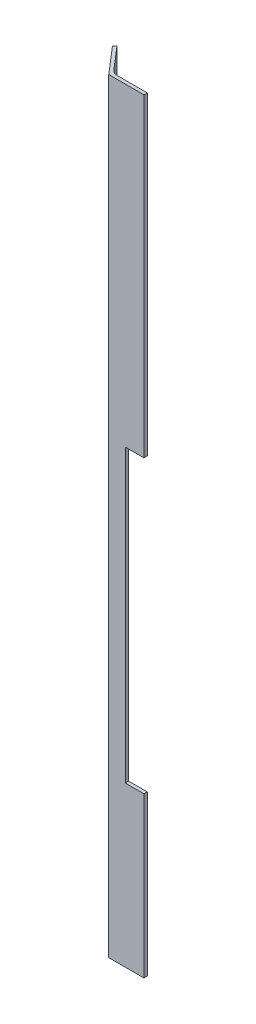
ISO-10303-21;
HEADER;
FILE_DESCRIPTION(('STEP AP214'),'2;1');
FILE_NAME('part.step','',(''),(''),'','','');
FILE_SCHEMA(('AUTOMOTIVE_DESIGN { 1 0 10303 214 1 1 1 1 }'));
ENDSEC;
DATA;
#1=APPLICATION_CONTEXT('core data for automotive mechanical design processes');
#2=APPLICATION_PROTOCOL_DEFINITION('international standard','automotive_design',2000,#1);
#3=PRODUCT_CONTEXT('',#1,'mechanical');
#4=PRODUCT('Part','Part','',(#3));
#5=PRODUCT_RELATED_PRODUCT_CATEGORY('part','',(#4));
#6=PRODUCT_DEFINITION_FORMATION('','',#4);
#7=PRODUCT_DEFINITION_CONTEXT('part definition',#1,'design');
#8=PRODUCT_DEFINITION('design','',#6,#7);
#9=PRODUCT_DEFINITION_SHAPE('','',#8);
#10=(LENGTH_UNIT() NAMED_UNIT(*) SI_UNIT(.MILLI.,.METRE.));
#11=(NAMED_UNIT(*) PLANE_ANGLE_UNIT() SI_UNIT($,.RADIAN.));
#12=(NAMED_UNIT(*) SI_UNIT($,.STERADIAN.) SOLID_ANGLE_UNIT());
#13=UNCERTAINTY_MEASURE_WITH_UNIT(LENGTH_MEASURE(1.E-05),#10,'distance_accuracy_value','');
#14=(GEOMETRIC_REPRESENTATION_CONTEXT(3) GLOBAL_UNCERTAINTY_ASSIGNED_CONTEXT((#13)) GLOBAL_UNIT_ASSIGNED_CONTEXT((#10,
#11,#12)) REPRESENTATION_CONTEXT('',''));
#15=CARTESIAN_POINT('',(0.,0.,0.));
#16=DIRECTION('',(0.,0.,1.));
#17=DIRECTION('',(1.,0.,0.));
#18=AXIS2_PLACEMENT_3D('',#15,#16,#17);
#19=CARTESIAN_POINT('',(17.1228290420735,500.,1.51311833014707));
#20=DIRECTION('',(-1.,0.,0.));
#21=DIRECTION('',(0.,0.,1.));
#22=AXIS2_PLACEMENT_3D('',#19,#20,#21);
#23=PLANE('',#22);
#24=DIRECTION('',(0.,-1.,0.));
#25=VECTOR('',#24,1.);
#26=CARTESIAN_POINT('',(17.1228290420735,500.,-0.486881669852926));
#27=LINE('',#26,#25);
#28=CARTESIAN_POINT('',(17.1228290420735,135.941313923208,-0.486881669852926));
#29=VERTEX_POINT('',#28);
#30=CARTESIAN_POINT('',(17.1228290420735,40.,-0.486881669852926));
#31=VERTEX_POINT('',#30);
#32=EDGE_CURVE('E157',#29,#31,#27,.T.);
#33=ORIENTED_EDGE('',*,*,#32,.F.);
#34=DIRECTION('',(0.,0.,1.));
#35=VECTOR('',#34,1.);
#36=CARTESIAN_POINT('',(17.1228290420735,135.941313923208,1.51311833014707));
#37=LINE('',#36,#35);
#38=CARTESIAN_POINT('',(17.1228290420735,135.941313923208,1.51311833014707));
#39=VERTEX_POINT('',#38);
#40=EDGE_CURVE('E142',#29,#39,#37,.T.);
#41=ORIENTED_EDGE('',*,*,#40,.T.);
#42=DIRECTION('',(0.,-1.,0.));
#43=VECTOR('',#42,1.);
#44=CARTESIAN_POINT('',(17.1228290420735,500.,1.51311833014707));
#45=LINE('',#44,#43);
#46=CARTESIAN_POINT('',(17.1228290420735,40.,1.51311833014707));
#47=VERTEX_POINT('',#46);
#48=EDGE_CURVE('E128',#39,#47,#45,.T.);
#49=ORIENTED_EDGE('',*,*,#48,.T.);
#50=DIRECTION('',(0.,0.,-1.));
#51=VECTOR('',#50,1.);
#52=CARTESIAN_POINT('',(17.1228290420735,40.,1.51311833014707));
#53=LINE('',#52,#51);
#54=EDGE_CURVE('E151',#47,#31,#53,.T.);
#55=ORIENTED_EDGE('',*,*,#54,.T.);
#56=EDGE_LOOP('',(#33,#41,#49,#55));
#57=FACE_BOUND('',#56,.T.);
#58=ADVANCED_FACE('F31',(#57),#23,.F.);
#59=CARTESIAN_POINT('',(-0.931762463434703,500.,-5.48688166985293));
#60=DIRECTION('',(0.,-1.,0.));
#61=DIRECTION('',(0.,0.,-1.));
#62=AXIS2_PLACEMENT_3D('',#59,#60,#61);
#63=CYLINDRICAL_SURFACE('',#62,5.);
#64=CARTESIAN_POINT('',(-0.931762463434703,40.,-5.48688166985293));
#65=DIRECTION('',(0.,-1.,0.));
#66=DIRECTION('',(0.,0.,-1.));
#67=AXIS2_PLACEMENT_3D('',#64,#65,#66);
#68=CIRCLE('',#67,5.);
#69=CARTESIAN_POINT('',(-0.931762463434703,40.,-0.486881669852926));
#70=VERTEX_POINT('',#69);
#71=CARTESIAN_POINT('',(-4.7228806166599,40.,-2.22690879446172));
#72=VERTEX_POINT('',#71);
#73=EDGE_CURVE('E138',#70,#72,#68,.T.);
#74=ORIENTED_EDGE('',*,*,#73,.T.);
#75=DIRECTION('',(0.,-1.,0.));
#76=VECTOR('',#75,1.);
#77=CARTESIAN_POINT('',(-4.7228806166599,500.,-2.22690879446172));
#78=LINE('',#77,#76);
#79=CARTESIAN_POINT('',(-4.7228806166599,500.,-2.22690879446172));
#80=VERTEX_POINT('',#79);
#81=EDGE_CURVE('E166',#80,#72,#78,.T.);
#82=ORIENTED_EDGE('',*,*,#81,.F.);
#83=CARTESIAN_POINT('',(-0.931762463434703,500.,-5.48688166985293));
#84=DIRECTION('',(0.,-1.,0.));
#85=DIRECTION('',(0.,0.,-1.));
#86=AXIS2_PLACEMENT_3D('',#83,#84,#85);
#87=CIRCLE('',#86,5.);
#88=CARTESIAN_POINT('',(-0.931762463434703,500.,-0.486881669852926));
#89=VERTEX_POINT('',#88);
#90=EDGE_CURVE('E155',#89,#80,#87,.T.);
#91=ORIENTED_EDGE('',*,*,#90,.F.);
#92=DIRECTION('',(0.,-1.,0.));
#93=VECTOR('',#92,1.);
#94=CARTESIAN_POINT('',(-0.931762463434703,500.,-0.486881669852926));
#95=LINE('',#94,#93);
#96=EDGE_CURVE('E134',#89,#70,#95,.T.);
#97=ORIENTED_EDGE('',*,*,#96,.T.);
#98=EDGE_LOOP('',(#74,#82,#91,#97));
#99=FACE_BOUND('',#98,.T.);
#100=ADVANCED_FACE('F33',(#99),#63,.F.);
#101=CARTESIAN_POINT('',(-16.3083976555303,500.,-15.7000466515645));
#102=DIRECTION('',(-0.758223630645039,0.,0.651994575078241));
#103=DIRECTION('',(0.651994575078241,0.,0.758223630645039));
#104=AXIS2_PLACEMENT_3D('',#101,#102,#103);
#105=PLANE('',#104);
#106=DIRECTION('',(-0.651994575078241,0.,-0.758223630645039));
#107=VECTOR('',#106,1.);
#108=CARTESIAN_POINT('',(-16.3083976555303,40.,-15.7000466515645));
#109=LINE('',#108,#107);
#110=CARTESIAN_POINT('',(-16.3083976555303,40.,-15.7000466515645));
#111=VERTEX_POINT('',#110);
#112=EDGE_CURVE('E141',#72,#111,#109,.T.);
#113=ORIENTED_EDGE('',*,*,#112,.T.);
#114=DIRECTION('',(0.,-1.,0.));
#115=VECTOR('',#114,1.);
#116=CARTESIAN_POINT('',(-16.3083976555303,500.,-15.7000466515645));
#117=LINE('',#116,#115);
#118=CARTESIAN_POINT('',(-16.3083976555303,500.,-15.7000466515645));
#119=VERTEX_POINT('',#118);
#120=EDGE_CURVE('E163',#119,#111,#117,.T.);
#121=ORIENTED_EDGE('',*,*,#120,.F.);
#122=DIRECTION('',(-0.651994575078241,0.,-0.758223630645039));
#123=VECTOR('',#122,1.);
#124=CARTESIAN_POINT('',(-16.3083976555303,500.,-15.7000466515645));
#125=LINE('',#124,#123);
#126=EDGE_CURVE('E93',#80,#119,#125,.T.);
#127=ORIENTED_EDGE('',*,*,#126,.F.);
#128=ORIENTED_EDGE('',*,*,#81,.T.);
#129=EDGE_LOOP('',(#113,#121,#127,#128));
#130=FACE_BOUND('',#129,.T.);
#131=ADVANCED_FACE('F227',(#130),#105,.F.);
#132=CARTESIAN_POINT('',(-17.7667098470109,500.,-14.4460477003489));
#133=DIRECTION('',(0.651994575078241,0.,0.758223630645039));
#134=DIRECTION('',(0.758223630645039,0.,-0.651994575078241));
#135=AXIS2_PLACEMENT_3D('',#132,#133,#134);
#136=PLANE('',#135);
#137=DIRECTION('',(-0.758223630645039,0.,0.651994575078241));
#138=VECTOR('',#137,1.);
#139=CARTESIAN_POINT('',(-17.7667098470109,40.,-14.4460477003489));
#140=LINE('',#139,#138);
#141=CARTESIAN_POINT('',(-17.7667098470109,40.,-14.4460477003489));
#142=VERTEX_POINT('',#141);
#143=EDGE_CURVE('E144',#111,#142,#140,.T.);
#144=ORIENTED_EDGE('',*,*,#143,.T.);
#145=DIRECTION('',(0.,-1.,0.));
#146=VECTOR('',#145,1.);
#147=CARTESIAN_POINT('',(-17.7667098470109,500.,-14.4460477003489));
#148=LINE('',#147,#146);
#149=CARTESIAN_POINT('',(-17.7667098470109,500.,-14.4460477003489));
#150=VERTEX_POINT('',#149);
#151=EDGE_CURVE('E160',#150,#142,#148,.T.);
#152=ORIENTED_EDGE('',*,*,#151,.F.);
#153=DIRECTION('',(-0.758223630645039,0.,0.651994575078241));
#154=VECTOR('',#153,1.);
#155=CARTESIAN_POINT('',(-17.7667098470109,500.,-14.4460477003489));
#156=LINE('',#155,#154);
#157=EDGE_CURVE('E202',#119,#150,#156,.T.);
#158=ORIENTED_EDGE('',*,*,#157,.F.);
#159=ORIENTED_EDGE('',*,*,#120,.T.);
#160=EDGE_LOOP('',(#144,#152,#158,#159));
#161=FACE_BOUND('',#160,.T.);
#162=ADVANCED_FACE('F206',(#161),#136,.F.);
#163=CARTESIAN_POINT('',(-17.7667098470109,500.,-14.4460477003489));
#164=DIRECTION('',(0.758223630645039,0.,-0.651994575078241));
#165=DIRECTION('',(-0.651994575078241,0.,-0.758223630645039));
#166=AXIS2_PLACEMENT_3D('',#163,#164,#165);
#167=PLANE('',#166);
#168=DIRECTION('',(0.651994575078241,0.,0.758223630645039));
#169=VECTOR('',#168,1.);
#170=CARTESIAN_POINT('',(-17.7667098470109,40.,-14.4460477003489));
#171=LINE('',#170,#169);
#172=CARTESIAN_POINT('',(-4.04346349315579,40.,1.51311833014707));
#173=VERTEX_POINT('',#172);
#174=EDGE_CURVE('E146',#142,#173,#171,.T.);
#175=ORIENTED_EDGE('',*,*,#174,.T.);
#176=DIRECTION('',(0.,-1.,0.));
#177=VECTOR('',#176,1.);
#178=CARTESIAN_POINT('',(-4.04346349315579,500.,1.51311833014707));
#179=LINE('',#178,#177);
#180=CARTESIAN_POINT('',(-4.04346349315579,500.,1.51311833014707));
#181=VERTEX_POINT('',#180);
#182=EDGE_CURVE('E127',#181,#173,#179,.T.);
#183=ORIENTED_EDGE('',*,*,#182,.F.);
#184=DIRECTION('',(0.651994575078241,0.,0.758223630645039));
#185=VECTOR('',#184,1.);
#186=CARTESIAN_POINT('',(-17.7667098470109,500.,-14.4460477003489));
#187=LINE('',#186,#185);
#188=EDGE_CURVE('E112',#150,#181,#187,.T.);
#189=ORIENTED_EDGE('',*,*,#188,.F.);
#190=ORIENTED_EDGE('',*,*,#151,.T.);
#191=EDGE_LOOP('',(#175,#183,#189,#190));
#192=FACE_BOUND('',#191,.T.);
#193=ADVANCED_FACE('F210',(#192),#167,.F.);
#194=CARTESIAN_POINT('',(-4.04346349315579,500.,1.51311833014707));
#195=DIRECTION('',(0.,0.,-1.));
#196=DIRECTION('',(-1.,0.,0.));
#197=AXIS2_PLACEMENT_3D('',#194,#195,#196);
#198=PLANE('',#197);
#199=ORIENTED_EDGE('',*,*,#48,.F.);
#200=DIRECTION('',(1.,0.,0.));
#201=VECTOR('',#200,1.);
#202=CARTESIAN_POINT('',(19.8228031938008,135.941313923208,1.51311833014707));
#203=LINE('',#202,#201);
#204=CARTESIAN_POINT('',(5.92872841611938,135.941313923208,1.51311833014707));
#205=VERTEX_POINT('',#204);
#206=EDGE_CURVE('E193',#205,#39,#203,.T.);
#207=ORIENTED_EDGE('',*,*,#206,.F.);
#208=DIRECTION('',(0.,-1.,0.));
#209=VECTOR('',#208,1.);
#210=CARTESIAN_POINT('',(5.92872841611938,310.903246291502,1.51311833014707));
#211=LINE('',#210,#209);
#212=CARTESIAN_POINT('',(5.92872841611938,310.903246291502,1.51311833014707));
#213=VERTEX_POINT('',#212);
#214=EDGE_CURVE('E186',#213,#205,#211,.T.);
#215=ORIENTED_EDGE('',*,*,#214,.F.);
#216=DIRECTION('',(-1.,0.,0.));
#217=VECTOR('',#216,1.);
#218=CARTESIAN_POINT('',(19.8228031938008,310.903246291502,1.51311833014707));
#219=LINE('',#218,#217);
#220=CARTESIAN_POINT('',(17.1228290420735,310.903246291502,1.51311833014707));
#221=VERTEX_POINT('',#220);
#222=EDGE_CURVE('E124',#221,#213,#219,.T.);
#223=ORIENTED_EDGE('',*,*,#222,.F.);
#224=CARTESIAN_POINT('',(17.1228290420735,500.,1.51311833014707));
#225=VERTEX_POINT('',#224);
#226=EDGE_CURVE('E119',#225,#221,#45,.T.);
#227=ORIENTED_EDGE('',*,*,#226,.F.);
#228=DIRECTION('',(1.,0.,0.));
#229=VECTOR('',#228,1.);
#230=CARTESIAN_POINT('',(-4.04346349315579,500.,1.51311833014707));
#231=LINE('',#230,#229);
#232=EDGE_CURVE('E105',#181,#225,#231,.T.);
#233=ORIENTED_EDGE('',*,*,#232,.F.);
#234=ORIENTED_EDGE('',*,*,#182,.T.);
#235=DIRECTION('',(1.,0.,0.));
#236=VECTOR('',#235,1.);
#237=CARTESIAN_POINT('',(-4.04346349315579,40.,1.51311833014707));
#238=LINE('',#237,#236);
#239=EDGE_CURVE('E148',#173,#47,#238,.T.);
#240=ORIENTED_EDGE('',*,*,#239,.T.);
#241=EDGE_LOOP('',(#199,#207,#215,#223,#227,#233,#234,#240));
#242=FACE_BOUND('',#241,.T.);
#243=ADVANCED_FACE('F121',(#242),#198,.F.);
#244=ORIENTED_EDGE('',*,*,#226,.T.);
#245=DIRECTION('',(0.,0.,-1.));
#246=VECTOR('',#245,1.);
#247=CARTESIAN_POINT('',(17.1228290420735,310.903246291502,1.51311833014707));
#248=LINE('',#247,#246);
#249=CARTESIAN_POINT('',(17.1228290420735,310.903246291502,-0.486881669852926));
#250=VERTEX_POINT('',#249);
#251=EDGE_CURVE('E190',#221,#250,#248,.T.);
#252=ORIENTED_EDGE('',*,*,#251,.T.);
#253=CARTESIAN_POINT('',(17.1228290420735,500.,-0.486881669852926));
#254=VERTEX_POINT('',#253);
#255=EDGE_CURVE('E132',#254,#250,#27,.T.);
#256=ORIENTED_EDGE('',*,*,#255,.F.);
#257=DIRECTION('',(0.,0.,-1.));
#258=VECTOR('',#257,1.);
#259=CARTESIAN_POINT('',(17.1228290420735,500.,1.51311833014707));
#260=LINE('',#259,#258);
#261=EDGE_CURVE('E109',#225,#254,#260,.T.);
#262=ORIENTED_EDGE('',*,*,#261,.F.);
#263=EDGE_LOOP('',(#244,#252,#256,#262));
#264=FACE_BOUND('',#263,.T.);
#265=ADVANCED_FACE('F130',(#264),#23,.F.);
#266=CARTESIAN_POINT('',(-0.931762463434703,500.,-0.486881669852926));
#267=DIRECTION('',(0.,0.,1.));
#268=DIRECTION('',(1.,0.,0.));
#269=AXIS2_PLACEMENT_3D('',#266,#267,#268);
#270=PLANE('',#269);
#271=DIRECTION('',(0.,-1.,0.));
#272=VECTOR('',#271,1.);
#273=CARTESIAN_POINT('',(5.92872841611938,500.,-0.486881669852926));
#274=LINE('',#273,#272);
#275=CARTESIAN_POINT('',(5.92872841611938,310.903246291502,-0.486881669852926));
#276=VERTEX_POINT('',#275);
#277=CARTESIAN_POINT('',(5.92872841611938,135.941313923208,-0.486881669852926));
#278=VERTEX_POINT('',#277);
#279=EDGE_CURVE('E39',#276,#278,#274,.T.);
#280=ORIENTED_EDGE('',*,*,#279,.T.);
#281=DIRECTION('',(1.,0.,0.));
#282=VECTOR('',#281,1.);
#283=CARTESIAN_POINT('',(-0.931762463434703,135.941313923208,-0.486881669852926));
#284=LINE('',#283,#282);
#285=EDGE_CURVE('E11',#278,#29,#284,.T.);
#286=ORIENTED_EDGE('',*,*,#285,.T.);
#287=ORIENTED_EDGE('',*,*,#32,.T.);
#288=DIRECTION('',(-1.,0.,0.));
#289=VECTOR('',#288,1.);
#290=CARTESIAN_POINT('',(-0.931762463434703,40.,-0.486881669852926));
#291=LINE('',#290,#289);
#292=EDGE_CURVE('E84',#31,#70,#291,.T.);
#293=ORIENTED_EDGE('',*,*,#292,.T.);
#294=ORIENTED_EDGE('',*,*,#96,.F.);
#295=DIRECTION('',(-1.,0.,0.));
#296=VECTOR('',#295,1.);
#297=CARTESIAN_POINT('',(-0.931762463434703,500.,-0.486881669852926));
#298=LINE('',#297,#296);
#299=EDGE_CURVE('E55',#254,#89,#298,.T.);
#300=ORIENTED_EDGE('',*,*,#299,.F.);
#301=ORIENTED_EDGE('',*,*,#255,.T.);
#302=DIRECTION('',(-1.,0.,0.));
#303=VECTOR('',#302,1.);
#304=CARTESIAN_POINT('',(-0.931762463434703,310.903246291502,-0.486881669852926));
#305=LINE('',#304,#303);
#306=EDGE_CURVE('E168',#250,#276,#305,.T.);
#307=ORIENTED_EDGE('',*,*,#306,.T.);
#308=EDGE_LOOP('',(#280,#286,#287,#293,#294,#300,#301,#307));
#309=FACE_BOUND('',#308,.T.);
#310=ADVANCED_FACE('F172',(#309),#270,.F.);
#311=CARTESIAN_POINT('',(-0.931762463434703,500.,-5.48688166985293));
#312=DIRECTION('',(0.,-1.,0.));
#313=DIRECTION('',(0.,0.,-1.));
#314=AXIS2_PLACEMENT_3D('',#311,#312,#313);
#315=PLANE('',#314);
#316=ORIENTED_EDGE('',*,*,#90,.T.);
#317=ORIENTED_EDGE('',*,*,#126,.T.);
#318=ORIENTED_EDGE('',*,*,#157,.T.);
#319=ORIENTED_EDGE('',*,*,#188,.T.);
#320=ORIENTED_EDGE('',*,*,#232,.T.);
#321=ORIENTED_EDGE('',*,*,#261,.T.);
#322=ORIENTED_EDGE('',*,*,#299,.T.);
#323=EDGE_LOOP('',(#316,#317,#318,#319,#320,#321,#322));
#324=FACE_BOUND('',#323,.T.);
#325=ADVANCED_FACE('F107',(#324),#315,.F.);
#326=CARTESIAN_POINT('',(-0.931762463434703,40.,-5.48688166985293));
#327=DIRECTION('',(0.,-1.,0.));
#328=DIRECTION('',(0.,0.,-1.));
#329=AXIS2_PLACEMENT_3D('',#326,#327,#328);
#330=PLANE('',#329);
#331=ORIENTED_EDGE('',*,*,#73,.F.);
#332=ORIENTED_EDGE('',*,*,#292,.F.);
#333=ORIENTED_EDGE('',*,*,#54,.F.);
#334=ORIENTED_EDGE('',*,*,#239,.F.);
#335=ORIENTED_EDGE('',*,*,#174,.F.);
#336=ORIENTED_EDGE('',*,*,#143,.F.);
#337=ORIENTED_EDGE('',*,*,#112,.F.);
#338=EDGE_LOOP('',(#331,#332,#333,#334,#335,#336,#337));
#339=FACE_BOUND('',#338,.T.);
#340=ADVANCED_FACE('F215',(#339),#330,.T.);
#341=CARTESIAN_POINT('',(19.8228031938008,135.941313923208,-15.7000466515645));
#342=DIRECTION('',(0.,-1.,0.));
#343=DIRECTION('',(0.,0.,-1.));
#344=AXIS2_PLACEMENT_3D('',#341,#342,#343);
#345=PLANE('',#344);
#346=ORIENTED_EDGE('',*,*,#285,.F.);
#347=DIRECTION('',(0.,0.,1.));
#348=VECTOR('',#347,1.);
#349=CARTESIAN_POINT('',(5.92872841611938,135.941313923208,-15.7000466515645));
#350=LINE('',#349,#348);
#351=EDGE_CURVE('E184',#278,#205,#350,.T.);
#352=ORIENTED_EDGE('',*,*,#351,.T.);
#353=ORIENTED_EDGE('',*,*,#206,.T.);
#354=ORIENTED_EDGE('',*,*,#40,.F.);
#355=EDGE_LOOP('',(#346,#352,#353,#354));
#356=FACE_BOUND('',#355,.T.);
#357=ADVANCED_FACE('F298',(#356),#345,.F.);
#358=CARTESIAN_POINT('',(5.92872841611938,310.903246291502,-15.7000466515645));
#359=DIRECTION('',(-1.,0.,0.));
#360=DIRECTION('',(0.,0.,1.));
#361=AXIS2_PLACEMENT_3D('',#358,#359,#360);
#362=PLANE('',#361);
#363=DIRECTION('',(0.,0.,1.));
#364=VECTOR('',#363,1.);
#365=CARTESIAN_POINT('',(5.92872841611938,310.903246291502,-15.7000466515645));
#366=LINE('',#365,#364);
#367=EDGE_CURVE('E46',#276,#213,#366,.T.);
#368=ORIENTED_EDGE('',*,*,#367,.T.);
#369=ORIENTED_EDGE('',*,*,#214,.T.);
#370=ORIENTED_EDGE('',*,*,#351,.F.);
#371=ORIENTED_EDGE('',*,*,#279,.F.);
#372=EDGE_LOOP('',(#368,#369,#370,#371));
#373=FACE_BOUND('',#372,.T.);
#374=ADVANCED_FACE('F180',(#373),#362,.F.);
#375=CARTESIAN_POINT('',(19.8228031938008,310.903246291502,-15.7000466515645));
#376=DIRECTION('',(0.,1.,0.));
#377=DIRECTION('',(0.,0.,1.));
#378=AXIS2_PLACEMENT_3D('',#375,#376,#377);
#379=PLANE('',#378);
#380=ORIENTED_EDGE('',*,*,#222,.T.);
#381=ORIENTED_EDGE('',*,*,#367,.F.);
#382=ORIENTED_EDGE('',*,*,#306,.F.);
#383=ORIENTED_EDGE('',*,*,#251,.F.);
#384=EDGE_LOOP('',(#380,#381,#382,#383));
#385=FACE_BOUND('',#384,.T.);
#386=ADVANCED_FACE('F223',(#385),#379,.F.);
#387=CLOSED_SHELL('',(#58,#100,#131,#162,#193,#243,#265,#310,#325,#340,#357,#374,#386));
#388=MANIFOLD_SOLID_BREP('B2',#387);
#389=ADVANCED_BREP_SHAPE_REPRESENTATION('',(#18,#388),#14);
#390=SHAPE_DEFINITION_REPRESENTATION(#9,#389);
ENDSEC;
END-ISO-10303-21;
